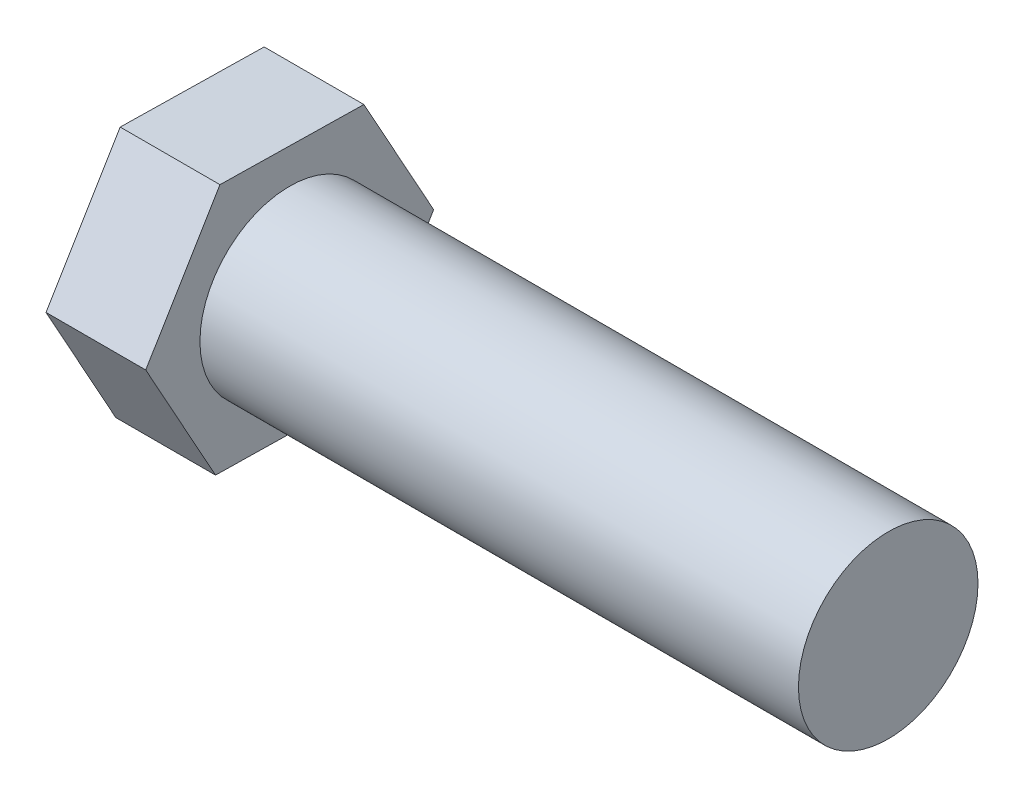
ISO-10303-21;
HEADER;
FILE_DESCRIPTION(('STEP AP214'),'2;1');
FILE_NAME('part.step','',(''),(''),'','','');
FILE_SCHEMA(('AUTOMOTIVE_DESIGN { 1 0 10303 214 1 1 1 1 }'));
ENDSEC;
DATA;
#1=APPLICATION_CONTEXT('core data for automotive mechanical design processes');
#2=APPLICATION_PROTOCOL_DEFINITION('international standard','automotive_design',2000,#1);
#3=PRODUCT_CONTEXT('',#1,'mechanical');
#4=PRODUCT('Part','Part','',(#3));
#5=PRODUCT_RELATED_PRODUCT_CATEGORY('part','',(#4));
#6=PRODUCT_DEFINITION_FORMATION('','',#4);
#7=PRODUCT_DEFINITION_CONTEXT('part definition',#1,'design');
#8=PRODUCT_DEFINITION('design','',#6,#7);
#9=PRODUCT_DEFINITION_SHAPE('','',#8);
#10=(LENGTH_UNIT() NAMED_UNIT(*) SI_UNIT(.MILLI.,.METRE.));
#11=(NAMED_UNIT(*) PLANE_ANGLE_UNIT() SI_UNIT($,.RADIAN.));
#12=(NAMED_UNIT(*) SI_UNIT($,.STERADIAN.) SOLID_ANGLE_UNIT());
#13=UNCERTAINTY_MEASURE_WITH_UNIT(LENGTH_MEASURE(1.E-05),#10,'distance_accuracy_value','');
#14=(GEOMETRIC_REPRESENTATION_CONTEXT(3) GLOBAL_UNCERTAINTY_ASSIGNED_CONTEXT((#13)) GLOBAL_UNIT_ASSIGNED_CONTEXT((#10,
#11,#12)) REPRESENTATION_CONTEXT('',''));
#15=CARTESIAN_POINT('',(0.,0.,0.));
#16=DIRECTION('',(0.,0.,1.));
#17=DIRECTION('',(1.,0.,0.));
#18=AXIS2_PLACEMENT_3D('',#15,#16,#17);
#19=CARTESIAN_POINT('',(-0.6,0.,0.));
#20=DIRECTION('',(-1.,0.,0.));
#21=DIRECTION('',(0.,0.,1.));
#22=AXIS2_PLACEMENT_3D('',#19,#20,#21);
#23=PLANE('',#22);
#24=DIRECTION('',(0.,0.856988725408425,-0.515335157468267));
#25=VECTOR('',#24,1.);
#26=CARTESIAN_POINT('',(-0.6,0.256906077015476,14.4314702161951));
#27=LINE('',#26,#25);
#28=CARTESIAN_POINT('',(-0.6,0.256906077015476,14.4314702161951));
#29=VERTEX_POINT('',#28);
#30=CARTESIAN_POINT('',(-0.6,12.6264728596912,6.99324791901554));
#31=VERTEX_POINT('',#30);
#32=EDGE_CURVE('E141',#29,#31,#27,.T.);
#33=ORIENTED_EDGE('',*,*,#32,.F.);
#34=DIRECTION('',(0.,0.874787700534985,0.484506428226409));
#35=VECTOR('',#34,1.);
#36=CARTESIAN_POINT('',(-0.6,-12.3695667826757,7.43822229717955));
#37=LINE('',#36,#35);
#38=CARTESIAN_POINT('',(-0.6,-12.3695667826757,7.43822229717955));
#39=VERTEX_POINT('',#38);
#40=EDGE_CURVE('E97',#39,#29,#37,.T.);
#41=ORIENTED_EDGE('',*,*,#40,.F.);
#42=DIRECTION('',(0.,0.0177989751265602,0.999841585694676));
#43=VECTOR('',#42,1.);
#44=CARTESIAN_POINT('',(-0.6,-12.6264728596912,-6.99324791901554));
#45=LINE('',#44,#43);
#46=CARTESIAN_POINT('',(-0.6,-12.6264728596912,-6.99324791901554));
#47=VERTEX_POINT('',#46);
#48=EDGE_CURVE('E91',#47,#39,#45,.T.);
#49=ORIENTED_EDGE('',*,*,#48,.F.);
#50=DIRECTION('',(0.,-0.856988725408425,0.515335157468266));
#51=VECTOR('',#50,1.);
#52=CARTESIAN_POINT('',(-0.6,-0.256906077015476,-14.4314702161951));
#53=LINE('',#52,#51);
#54=CARTESIAN_POINT('',(-0.6,-0.256906077015476,-14.4314702161951));
#55=VERTEX_POINT('',#54);
#56=EDGE_CURVE('E128',#55,#47,#53,.T.);
#57=ORIENTED_EDGE('',*,*,#56,.F.);
#58=DIRECTION('',(0.,-0.874787700534985,-0.484506428226409));
#59=VECTOR('',#58,1.);
#60=CARTESIAN_POINT('',(-0.6,12.3695667826757,-7.43822229717955));
#61=LINE('',#60,#59);
#62=CARTESIAN_POINT('',(-0.6,12.3695667826757,-7.43822229717955));
#63=VERTEX_POINT('',#62);
#64=EDGE_CURVE('E188',#63,#55,#61,.T.);
#65=ORIENTED_EDGE('',*,*,#64,.F.);
#66=DIRECTION('',(0.,-0.01779897512656,-0.999841585694676));
#67=VECTOR('',#66,1.);
#68=CARTESIAN_POINT('',(-0.6,12.6264728596912,6.99324791901554));
#69=LINE('',#68,#67);
#70=EDGE_CURVE('E146',#31,#63,#69,.T.);
#71=ORIENTED_EDGE('',*,*,#70,.F.);
#72=EDGE_LOOP('',(#33,#41,#49,#57,#65,#71));
#73=FACE_BOUND('',#72,.T.);
#74=CARTESIAN_POINT('',(-0.600000000000003,0.,0.));
#75=DIRECTION('',(-1.,0.,0.));
#76=DIRECTION('',(0.,0.,1.));
#77=AXIS2_PLACEMENT_3D('',#74,#75,#76);
#78=CIRCLE('',#77,9.);
#79=CARTESIAN_POINT('',(-0.600000000000003,0.,9.));
#80=VERTEX_POINT('',#79);
#81=EDGE_CURVE('E60',#80,#80,#78,.T.);
#82=ORIENTED_EDGE('',*,*,#81,.T.);
#83=EDGE_LOOP('',(#82));
#84=FACE_BOUND('',#83,.T.);
#85=ADVANCED_FACE('F49',(#73,#84),#23,.F.);
#86=CARTESIAN_POINT('',(-10.6,0.256906077015476,14.4314702161951));
#87=DIRECTION('',(0.,-0.515335157468267,-0.856988725408425));
#88=DIRECTION('',(0.,0.856988725408425,-0.515335157468267));
#89=AXIS2_PLACEMENT_3D('',#86,#87,#88);
#90=PLANE('',#89);
#91=ORIENTED_EDGE('',*,*,#32,.T.);
#92=DIRECTION('',(1.,0.,0.));
#93=VECTOR('',#92,1.);
#94=CARTESIAN_POINT('',(-10.6,12.6264728596912,6.99324791901554));
#95=LINE('',#94,#93);
#96=CARTESIAN_POINT('',(-10.6,12.6264728596912,6.99324791901554));
#97=VERTEX_POINT('',#96);
#98=EDGE_CURVE('E157',#97,#31,#95,.T.);
#99=ORIENTED_EDGE('',*,*,#98,.F.);
#100=DIRECTION('',(0.,0.856988725408425,-0.515335157468267));
#101=VECTOR('',#100,1.);
#102=CARTESIAN_POINT('',(-10.6,0.256906077015476,14.4314702161951));
#103=LINE('',#102,#101);
#104=CARTESIAN_POINT('',(-10.6,0.256906077015476,14.4314702161951));
#105=VERTEX_POINT('',#104);
#106=EDGE_CURVE('E173',#105,#97,#103,.T.);
#107=ORIENTED_EDGE('',*,*,#106,.F.);
#108=DIRECTION('',(1.,0.,0.));
#109=VECTOR('',#108,1.);
#110=CARTESIAN_POINT('',(-10.6,0.256906077015476,14.4314702161951));
#111=LINE('',#110,#109);
#112=EDGE_CURVE('E137',#105,#29,#111,.T.);
#113=ORIENTED_EDGE('',*,*,#112,.T.);
#114=EDGE_LOOP('',(#91,#99,#107,#113));
#115=FACE_BOUND('',#114,.T.);
#116=ADVANCED_FACE('F199',(#115),#90,.F.);
#117=CARTESIAN_POINT('',(-10.6,12.6264728596912,6.99324791901554));
#118=DIRECTION('',(0.,-0.999841585694676,0.01779897512656));
#119=DIRECTION('',(0.,-0.01779897512656,-0.999841585694676));
#120=AXIS2_PLACEMENT_3D('',#117,#118,#119);
#121=PLANE('',#120);
#122=ORIENTED_EDGE('',*,*,#70,.T.);
#123=DIRECTION('',(1.,0.,0.));
#124=VECTOR('',#123,1.);
#125=CARTESIAN_POINT('',(-10.6,12.3695667826757,-7.43822229717955));
#126=LINE('',#125,#124);
#127=CARTESIAN_POINT('',(-10.6,12.3695667826757,-7.43822229717955));
#128=VERTEX_POINT('',#127);
#129=EDGE_CURVE('E160',#128,#63,#126,.T.);
#130=ORIENTED_EDGE('',*,*,#129,.F.);
#131=DIRECTION('',(0.,-0.01779897512656,-0.999841585694676));
#132=VECTOR('',#131,1.);
#133=CARTESIAN_POINT('',(-10.6,12.6264728596912,6.99324791901554));
#134=LINE('',#133,#132);
#135=EDGE_CURVE('E106',#97,#128,#134,.T.);
#136=ORIENTED_EDGE('',*,*,#135,.F.);
#137=ORIENTED_EDGE('',*,*,#98,.T.);
#138=EDGE_LOOP('',(#122,#130,#136,#137));
#139=FACE_BOUND('',#138,.T.);
#140=ADVANCED_FACE('F190',(#139),#121,.F.);
#141=CARTESIAN_POINT('',(-10.6,12.3695667826757,-7.43822229717955));
#142=DIRECTION('',(0.,-0.484506428226409,0.874787700534986));
#143=DIRECTION('',(0.,-0.874787700534986,-0.484506428226409));
#144=AXIS2_PLACEMENT_3D('',#141,#142,#143);
#145=PLANE('',#144);
#146=ORIENTED_EDGE('',*,*,#64,.T.);
#147=DIRECTION('',(1.,0.,0.));
#148=VECTOR('',#147,1.);
#149=CARTESIAN_POINT('',(-10.6,-0.256906077015476,-14.4314702161951));
#150=LINE('',#149,#148);
#151=CARTESIAN_POINT('',(-10.6,-0.256906077015476,-14.4314702161951));
#152=VERTEX_POINT('',#151);
#153=EDGE_CURVE('E130',#152,#55,#150,.T.);
#154=ORIENTED_EDGE('',*,*,#153,.F.);
#155=DIRECTION('',(0.,-0.874787700534985,-0.484506428226409));
#156=VECTOR('',#155,1.);
#157=CARTESIAN_POINT('',(-10.6,12.3695667826757,-7.43822229717955));
#158=LINE('',#157,#156);
#159=EDGE_CURVE('E119',#128,#152,#158,.T.);
#160=ORIENTED_EDGE('',*,*,#159,.F.);
#161=ORIENTED_EDGE('',*,*,#129,.T.);
#162=EDGE_LOOP('',(#146,#154,#160,#161));
#163=FACE_BOUND('',#162,.T.);
#164=ADVANCED_FACE('F196',(#163),#145,.F.);
#165=CARTESIAN_POINT('',(-10.6,-0.256906077015476,-14.4314702161951));
#166=DIRECTION('',(0.,0.515335157468266,0.856988725408425));
#167=DIRECTION('',(0.,-0.856988725408425,0.515335157468266));
#168=AXIS2_PLACEMENT_3D('',#165,#166,#167);
#169=PLANE('',#168);
#170=ORIENTED_EDGE('',*,*,#56,.T.);
#171=DIRECTION('',(1.,0.,0.));
#172=VECTOR('',#171,1.);
#173=CARTESIAN_POINT('',(-10.6,-12.6264728596912,-6.99324791901554));
#174=LINE('',#173,#172);
#175=CARTESIAN_POINT('',(-10.6,-12.6264728596912,-6.99324791901554));
#176=VERTEX_POINT('',#175);
#177=EDGE_CURVE('E125',#176,#47,#174,.T.);
#178=ORIENTED_EDGE('',*,*,#177,.F.);
#179=DIRECTION('',(0.,-0.856988725408425,0.515335157468266));
#180=VECTOR('',#179,1.);
#181=CARTESIAN_POINT('',(-10.6,-0.256906077015476,-14.4314702161951));
#182=LINE('',#181,#180);
#183=EDGE_CURVE('E113',#152,#176,#182,.T.);
#184=ORIENTED_EDGE('',*,*,#183,.F.);
#185=ORIENTED_EDGE('',*,*,#153,.T.);
#186=EDGE_LOOP('',(#170,#178,#184,#185));
#187=FACE_BOUND('',#186,.T.);
#188=ADVANCED_FACE('F126',(#187),#169,.F.);
#189=CARTESIAN_POINT('',(-10.6,-12.6264728596912,-6.99324791901554));
#190=DIRECTION('',(0.,0.999841585694676,-0.0177989751265602));
#191=DIRECTION('',(0.,0.0177989751265602,0.999841585694676));
#192=AXIS2_PLACEMENT_3D('',#189,#190,#191);
#193=PLANE('',#192);
#194=ORIENTED_EDGE('',*,*,#48,.T.);
#195=DIRECTION('',(1.,0.,0.));
#196=VECTOR('',#195,1.);
#197=CARTESIAN_POINT('',(-10.6,-12.3695667826757,7.43822229717955));
#198=LINE('',#197,#196);
#199=CARTESIAN_POINT('',(-10.6,-12.3695667826757,7.43822229717955));
#200=VERTEX_POINT('',#199);
#201=EDGE_CURVE('E131',#200,#39,#198,.T.);
#202=ORIENTED_EDGE('',*,*,#201,.F.);
#203=DIRECTION('',(0.,0.0177989751265602,0.999841585694676));
#204=VECTOR('',#203,1.);
#205=CARTESIAN_POINT('',(-10.6,-12.6264728596912,-6.99324791901554));
#206=LINE('',#205,#204);
#207=EDGE_CURVE('E117',#176,#200,#206,.T.);
#208=ORIENTED_EDGE('',*,*,#207,.F.);
#209=ORIENTED_EDGE('',*,*,#177,.T.);
#210=EDGE_LOOP('',(#194,#202,#208,#209));
#211=FACE_BOUND('',#210,.T.);
#212=ADVANCED_FACE('F133',(#211),#193,.F.);
#213=CARTESIAN_POINT('',(-10.6,-12.3695667826757,7.43822229717955));
#214=DIRECTION('',(0.,0.48450642822641,-0.874787700534985));
#215=DIRECTION('',(0.,0.874787700534985,0.48450642822641));
#216=AXIS2_PLACEMENT_3D('',#213,#214,#215);
#217=PLANE('',#216);
#218=ORIENTED_EDGE('',*,*,#40,.T.);
#219=ORIENTED_EDGE('',*,*,#112,.F.);
#220=DIRECTION('',(0.,0.874787700534985,0.484506428226409));
#221=VECTOR('',#220,1.);
#222=CARTESIAN_POINT('',(-10.6,-12.3695667826757,7.43822229717955));
#223=LINE('',#222,#221);
#224=EDGE_CURVE('E68',#200,#105,#223,.T.);
#225=ORIENTED_EDGE('',*,*,#224,.F.);
#226=ORIENTED_EDGE('',*,*,#201,.T.);
#227=EDGE_LOOP('',(#218,#219,#225,#226));
#228=FACE_BOUND('',#227,.T.);
#229=ADVANCED_FACE('F201',(#228),#217,.F.);
#230=CARTESIAN_POINT('',(-10.6,0.,0.));
#231=DIRECTION('',(-1.,0.,0.));
#232=DIRECTION('',(0.,0.,1.));
#233=AXIS2_PLACEMENT_3D('',#230,#231,#232);
#234=PLANE('',#233);
#235=ORIENTED_EDGE('',*,*,#106,.T.);
#236=ORIENTED_EDGE('',*,*,#135,.T.);
#237=ORIENTED_EDGE('',*,*,#159,.T.);
#238=ORIENTED_EDGE('',*,*,#183,.T.);
#239=ORIENTED_EDGE('',*,*,#207,.T.);
#240=ORIENTED_EDGE('',*,*,#224,.T.);
#241=EDGE_LOOP('',(#235,#236,#237,#238,#239,#240));
#242=FACE_BOUND('',#241,.T.);
#243=ADVANCED_FACE('F115',(#242),#234,.T.);
#244=CARTESIAN_POINT('',(59.4,0.,0.));
#245=DIRECTION('',(-1.,0.,0.));
#246=DIRECTION('',(0.,0.,1.));
#247=AXIS2_PLACEMENT_3D('',#244,#245,#246);
#248=CYLINDRICAL_SURFACE('',#247,9.);
#249=CARTESIAN_POINT('',(59.4,0.,0.));
#250=DIRECTION('',(1.,0.,0.));
#251=DIRECTION('',(0.,0.,-1.));
#252=AXIS2_PLACEMENT_3D('',#249,#250,#251);
#253=CIRCLE('',#252,9.);
#254=CARTESIAN_POINT('',(59.4,0.,-9.));
#255=VERTEX_POINT('',#254);
#256=EDGE_CURVE('E12',#255,#255,#253,.T.);
#257=ORIENTED_EDGE('',*,*,#256,.F.);
#258=EDGE_LOOP('',(#257));
#259=FACE_BOUND('',#258,.T.);
#260=ORIENTED_EDGE('',*,*,#81,.F.);
#261=EDGE_LOOP('',(#260));
#262=FACE_BOUND('',#261,.T.);
#263=ADVANCED_FACE('F51',(#259,#262),#248,.T.);
#264=CARTESIAN_POINT('',(59.4,0.,0.));
#265=DIRECTION('',(1.,0.,0.));
#266=DIRECTION('',(0.,0.,-1.));
#267=AXIS2_PLACEMENT_3D('',#264,#265,#266);
#268=PLANE('',#267);
#269=ORIENTED_EDGE('',*,*,#256,.T.);
#270=EDGE_LOOP('',(#269));
#271=FACE_BOUND('',#270,.T.);
#272=ADVANCED_FACE('F218',(#271),#268,.T.);
#273=CLOSED_SHELL('',(#85,#116,#140,#164,#188,#212,#229,#243,#263,#272));
#274=MANIFOLD_SOLID_BREP('B2',#273);
#275=ADVANCED_BREP_SHAPE_REPRESENTATION('',(#18,#274),#14);
#276=SHAPE_DEFINITION_REPRESENTATION(#9,#275);
ENDSEC;
END-ISO-10303-21;
